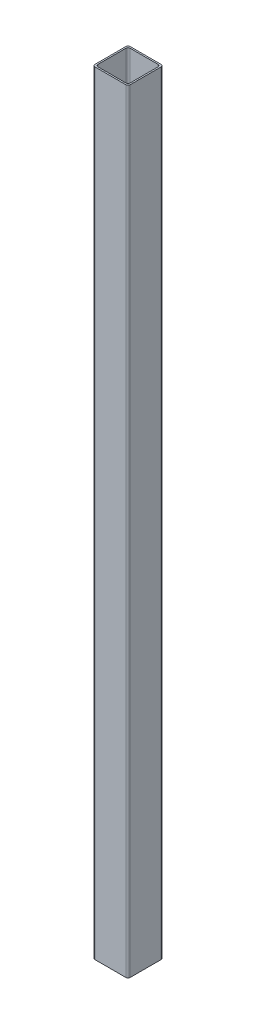
ISO-10303-21;
HEADER;
FILE_DESCRIPTION(('STEP AP214'),'2;1');
FILE_NAME('part.step','',(''),(''),'','','');
FILE_SCHEMA(('AUTOMOTIVE_DESIGN { 1 0 10303 214 1 1 1 1 }'));
ENDSEC;
DATA;
#1=APPLICATION_CONTEXT('core data for automotive mechanical design processes');
#2=APPLICATION_PROTOCOL_DEFINITION('international standard','automotive_design',2000,#1);
#3=PRODUCT_CONTEXT('',#1,'mechanical');
#4=PRODUCT('Part','Part','',(#3));
#5=PRODUCT_RELATED_PRODUCT_CATEGORY('part','',(#4));
#6=PRODUCT_DEFINITION_FORMATION('','',#4);
#7=PRODUCT_DEFINITION_CONTEXT('part definition',#1,'design');
#8=PRODUCT_DEFINITION('design','',#6,#7);
#9=PRODUCT_DEFINITION_SHAPE('','',#8);
#10=(LENGTH_UNIT() NAMED_UNIT(*) SI_UNIT(.MILLI.,.METRE.));
#11=(NAMED_UNIT(*) PLANE_ANGLE_UNIT() SI_UNIT($,.RADIAN.));
#12=(NAMED_UNIT(*) SI_UNIT($,.STERADIAN.) SOLID_ANGLE_UNIT());
#13=UNCERTAINTY_MEASURE_WITH_UNIT(LENGTH_MEASURE(1.E-05),#10,'distance_accuracy_value','');
#14=(GEOMETRIC_REPRESENTATION_CONTEXT(3) GLOBAL_UNCERTAINTY_ASSIGNED_CONTEXT((#13)) GLOBAL_UNIT_ASSIGNED_CONTEXT((#10,
#11,#12)) REPRESENTATION_CONTEXT('',''));
#15=CARTESIAN_POINT('',(0.,0.,0.));
#16=DIRECTION('',(0.,0.,1.));
#17=DIRECTION('',(1.,0.,0.));
#18=AXIS2_PLACEMENT_3D('',#15,#16,#17);
#19=CARTESIAN_POINT('',(-1.8,90.,1.8));
#20=DIRECTION('',(0.,-1.,0.));
#21=DIRECTION('',(0.,0.,-1.));
#22=AXIS2_PLACEMENT_3D('',#19,#20,#21);
#23=PLANE('',#22);
#24=CARTESIAN_POINT('',(-1.8,90.,1.8));
#25=DIRECTION('',(0.,1.,0.));
#26=DIRECTION('',(0.,0.,-1.));
#27=AXIS2_PLACEMENT_3D('',#24,#25,#26);
#28=CIRCLE('',#27,0.25);
#29=CARTESIAN_POINT('',(-2.05,90.,1.8));
#30=VERTEX_POINT('',#29);
#31=CARTESIAN_POINT('',(-1.8,90.,2.05));
#32=VERTEX_POINT('',#31);
#33=EDGE_CURVE('E217',#30,#32,#28,.T.);
#34=ORIENTED_EDGE('',*,*,#33,.T.);
#35=DIRECTION('',(1.,0.,0.));
#36=VECTOR('',#35,1.);
#37=CARTESIAN_POINT('',(-1.8,90.,2.05));
#38=LINE('',#37,#36);
#39=CARTESIAN_POINT('',(1.8,90.,2.05));
#40=VERTEX_POINT('',#39);
#41=EDGE_CURVE('E220',#32,#40,#38,.T.);
#42=ORIENTED_EDGE('',*,*,#41,.T.);
#43=CARTESIAN_POINT('',(1.8,90.,1.8));
#44=DIRECTION('',(0.,1.,0.));
#45=DIRECTION('',(0.,0.,1.));
#46=AXIS2_PLACEMENT_3D('',#43,#44,#45);
#47=CIRCLE('',#46,0.25);
#48=CARTESIAN_POINT('',(2.05,90.,1.8));
#49=VERTEX_POINT('',#48);
#50=EDGE_CURVE('E223',#40,#49,#47,.T.);
#51=ORIENTED_EDGE('',*,*,#50,.T.);
#52=DIRECTION('',(0.,0.,-1.));
#53=VECTOR('',#52,1.);
#54=CARTESIAN_POINT('',(2.05,90.,1.8));
#55=LINE('',#54,#53);
#56=CARTESIAN_POINT('',(2.05,90.,-1.8));
#57=VERTEX_POINT('',#56);
#58=EDGE_CURVE('E225',#49,#57,#55,.T.);
#59=ORIENTED_EDGE('',*,*,#58,.T.);
#60=CARTESIAN_POINT('',(1.8,90.,-1.8));
#61=DIRECTION('',(0.,1.,0.));
#62=DIRECTION('',(0.,0.,-1.));
#63=AXIS2_PLACEMENT_3D('',#60,#61,#62);
#64=CIRCLE('',#63,0.25);
#65=CARTESIAN_POINT('',(1.8,90.,-2.05));
#66=VERTEX_POINT('',#65);
#67=EDGE_CURVE('E227',#57,#66,#64,.T.);
#68=ORIENTED_EDGE('',*,*,#67,.T.);
#69=DIRECTION('',(-1.,0.,0.));
#70=VECTOR('',#69,1.);
#71=CARTESIAN_POINT('',(-1.8,90.,-2.05));
#72=LINE('',#71,#70);
#73=CARTESIAN_POINT('',(-1.8,90.,-2.05));
#74=VERTEX_POINT('',#73);
#75=EDGE_CURVE('E229',#66,#74,#72,.T.);
#76=ORIENTED_EDGE('',*,*,#75,.T.);
#77=CARTESIAN_POINT('',(-1.8,90.,-1.8));
#78=DIRECTION('',(0.,1.,0.));
#79=DIRECTION('',(0.,0.,-1.));
#80=AXIS2_PLACEMENT_3D('',#77,#78,#79);
#81=CIRCLE('',#80,0.25);
#82=CARTESIAN_POINT('',(-2.05,90.,-1.8));
#83=VERTEX_POINT('',#82);
#84=EDGE_CURVE('E231',#74,#83,#81,.T.);
#85=ORIENTED_EDGE('',*,*,#84,.T.);
#86=DIRECTION('',(0.,0.,1.));
#87=VECTOR('',#86,1.);
#88=CARTESIAN_POINT('',(-2.05,90.,1.8));
#89=LINE('',#88,#87);
#90=EDGE_CURVE('E233',#83,#30,#89,.T.);
#91=ORIENTED_EDGE('',*,*,#90,.T.);
#92=EDGE_LOOP('',(#34,#42,#51,#59,#68,#76,#85,#91));
#93=FACE_BOUND('',#92,.T.);
#94=CARTESIAN_POINT('',(1.625,90.,1.625));
#95=DIRECTION('',(0.,1.,0.));
#96=DIRECTION('',(0.,0.,1.));
#97=AXIS2_PLACEMENT_3D('',#94,#95,#96);
#98=CIRCLE('',#97,0.25);
#99=CARTESIAN_POINT('',(1.625,90.,1.875));
#100=VERTEX_POINT('',#99);
#101=CARTESIAN_POINT('',(1.875,90.,1.625));
#102=VERTEX_POINT('',#101);
#103=EDGE_CURVE('E152',#100,#102,#98,.T.);
#104=ORIENTED_EDGE('',*,*,#103,.F.);
#105=DIRECTION('',(1.,0.,0.));
#106=VECTOR('',#105,1.);
#107=CARTESIAN_POINT('',(-1.625,90.,1.875));
#108=LINE('',#107,#106);
#109=CARTESIAN_POINT('',(-1.625,90.,1.875));
#110=VERTEX_POINT('',#109);
#111=EDGE_CURVE('E185',#110,#100,#108,.T.);
#112=ORIENTED_EDGE('',*,*,#111,.F.);
#113=CARTESIAN_POINT('',(-1.625,90.,1.625));
#114=DIRECTION('',(0.,1.,0.));
#115=DIRECTION('',(0.,0.,-1.));
#116=AXIS2_PLACEMENT_3D('',#113,#114,#115);
#117=CIRCLE('',#116,0.25);
#118=CARTESIAN_POINT('',(-1.875,90.,1.625));
#119=VERTEX_POINT('',#118);
#120=EDGE_CURVE('E183',#119,#110,#117,.T.);
#121=ORIENTED_EDGE('',*,*,#120,.F.);
#122=DIRECTION('',(0.,0.,1.));
#123=VECTOR('',#122,1.);
#124=CARTESIAN_POINT('',(-1.875,90.,1.625));
#125=LINE('',#124,#123);
#126=CARTESIAN_POINT('',(-1.875,90.,-1.625));
#127=VERTEX_POINT('',#126);
#128=EDGE_CURVE('E181',#127,#119,#125,.T.);
#129=ORIENTED_EDGE('',*,*,#128,.F.);
#130=CARTESIAN_POINT('',(-1.625,90.,-1.625));
#131=DIRECTION('',(0.,1.,0.));
#132=DIRECTION('',(0.,0.,-1.));
#133=AXIS2_PLACEMENT_3D('',#130,#131,#132);
#134=CIRCLE('',#133,0.25);
#135=CARTESIAN_POINT('',(-1.625,90.,-1.875));
#136=VERTEX_POINT('',#135);
#137=EDGE_CURVE('E179',#136,#127,#134,.T.);
#138=ORIENTED_EDGE('',*,*,#137,.F.);
#139=DIRECTION('',(-1.,0.,0.));
#140=VECTOR('',#139,1.);
#141=CARTESIAN_POINT('',(-1.625,90.,-1.875));
#142=LINE('',#141,#140);
#143=CARTESIAN_POINT('',(1.625,90.,-1.875));
#144=VERTEX_POINT('',#143);
#145=EDGE_CURVE('E175',#144,#136,#142,.T.);
#146=ORIENTED_EDGE('',*,*,#145,.F.);
#147=CARTESIAN_POINT('',(1.625,90.,-1.625));
#148=DIRECTION('',(0.,1.,0.));
#149=DIRECTION('',(0.,0.,-1.));
#150=AXIS2_PLACEMENT_3D('',#147,#148,#149);
#151=CIRCLE('',#150,0.25);
#152=CARTESIAN_POINT('',(1.875,90.,-1.625));
#153=VERTEX_POINT('',#152);
#154=EDGE_CURVE('E173',#153,#144,#151,.T.);
#155=ORIENTED_EDGE('',*,*,#154,.F.);
#156=DIRECTION('',(0.,0.,-1.));
#157=VECTOR('',#156,1.);
#158=CARTESIAN_POINT('',(1.875,90.,1.625));
#159=LINE('',#158,#157);
#160=EDGE_CURVE('E160',#102,#153,#159,.T.);
#161=ORIENTED_EDGE('',*,*,#160,.F.);
#162=EDGE_LOOP('',(#104,#112,#121,#129,#138,#146,#155,#161));
#163=FACE_BOUND('',#162,.T.);
#164=ADVANCED_FACE('F39',(#93,#163),#23,.F.);
#165=CARTESIAN_POINT('',(-1.8,0.,1.8));
#166=DIRECTION('',(0.,-1.,0.));
#167=DIRECTION('',(0.,0.,-1.));
#168=AXIS2_PLACEMENT_3D('',#165,#166,#167);
#169=PLANE('',#168);
#170=CARTESIAN_POINT('',(-1.8,0.,1.8));
#171=DIRECTION('',(0.,1.,0.));
#172=DIRECTION('',(0.,0.,-1.));
#173=AXIS2_PLACEMENT_3D('',#170,#171,#172);
#174=CIRCLE('',#173,0.25);
#175=CARTESIAN_POINT('',(-2.05,0.,1.8));
#176=VERTEX_POINT('',#175);
#177=CARTESIAN_POINT('',(-1.8,0.,2.05));
#178=VERTEX_POINT('',#177);
#179=EDGE_CURVE('E168',#176,#178,#174,.T.);
#180=ORIENTED_EDGE('',*,*,#179,.F.);
#181=DIRECTION('',(0.,0.,1.));
#182=VECTOR('',#181,1.);
#183=CARTESIAN_POINT('',(-2.05,0.,1.8));
#184=LINE('',#183,#182);
#185=CARTESIAN_POINT('',(-2.05,0.,-1.8));
#186=VERTEX_POINT('',#185);
#187=EDGE_CURVE('E221',#186,#176,#184,.T.);
#188=ORIENTED_EDGE('',*,*,#187,.F.);
#189=CARTESIAN_POINT('',(-1.8,0.,-1.8));
#190=DIRECTION('',(0.,1.,0.));
#191=DIRECTION('',(0.,0.,-1.));
#192=AXIS2_PLACEMENT_3D('',#189,#190,#191);
#193=CIRCLE('',#192,0.25);
#194=CARTESIAN_POINT('',(-1.8,0.,-2.05));
#195=VERTEX_POINT('',#194);
#196=EDGE_CURVE('E248',#195,#186,#193,.T.);
#197=ORIENTED_EDGE('',*,*,#196,.F.);
#198=DIRECTION('',(-1.,0.,0.));
#199=VECTOR('',#198,1.);
#200=CARTESIAN_POINT('',(-1.8,0.,-2.05));
#201=LINE('',#200,#199);
#202=CARTESIAN_POINT('',(1.8,0.,-2.05));
#203=VERTEX_POINT('',#202);
#204=EDGE_CURVE('E246',#203,#195,#201,.T.);
#205=ORIENTED_EDGE('',*,*,#204,.F.);
#206=CARTESIAN_POINT('',(1.8,0.,-1.8));
#207=DIRECTION('',(0.,1.,0.));
#208=DIRECTION('',(0.,0.,-1.));
#209=AXIS2_PLACEMENT_3D('',#206,#207,#208);
#210=CIRCLE('',#209,0.25);
#211=CARTESIAN_POINT('',(2.05,0.,-1.8));
#212=VERTEX_POINT('',#211);
#213=EDGE_CURVE('E244',#212,#203,#210,.T.);
#214=ORIENTED_EDGE('',*,*,#213,.F.);
#215=DIRECTION('',(0.,0.,-1.));
#216=VECTOR('',#215,1.);
#217=CARTESIAN_POINT('',(2.05,0.,1.8));
#218=LINE('',#217,#216);
#219=CARTESIAN_POINT('',(2.05,0.,1.8));
#220=VERTEX_POINT('',#219);
#221=EDGE_CURVE('E242',#220,#212,#218,.T.);
#222=ORIENTED_EDGE('',*,*,#221,.F.);
#223=CARTESIAN_POINT('',(1.8,0.,1.8));
#224=DIRECTION('',(0.,1.,0.));
#225=DIRECTION('',(0.,0.,1.));
#226=AXIS2_PLACEMENT_3D('',#223,#224,#225);
#227=CIRCLE('',#226,0.25);
#228=CARTESIAN_POINT('',(1.8,0.,2.05));
#229=VERTEX_POINT('',#228);
#230=EDGE_CURVE('E240',#229,#220,#227,.T.);
#231=ORIENTED_EDGE('',*,*,#230,.F.);
#232=DIRECTION('',(1.,0.,0.));
#233=VECTOR('',#232,1.);
#234=CARTESIAN_POINT('',(-1.8,0.,2.05));
#235=LINE('',#234,#233);
#236=EDGE_CURVE('E238',#178,#229,#235,.T.);
#237=ORIENTED_EDGE('',*,*,#236,.F.);
#238=EDGE_LOOP('',(#180,#188,#197,#205,#214,#222,#231,#237));
#239=FACE_BOUND('',#238,.T.);
#240=DIRECTION('',(1.,0.,0.));
#241=VECTOR('',#240,1.);
#242=CARTESIAN_POINT('',(-1.625,0.,1.875));
#243=LINE('',#242,#241);
#244=CARTESIAN_POINT('',(-1.625,0.,1.875));
#245=VERTEX_POINT('',#244);
#246=CARTESIAN_POINT('',(1.625,0.,1.875));
#247=VERTEX_POINT('',#246);
#248=EDGE_CURVE('E161',#245,#247,#243,.T.);
#249=ORIENTED_EDGE('',*,*,#248,.T.);
#250=CARTESIAN_POINT('',(1.625,0.,1.625));
#251=DIRECTION('',(0.,1.,0.));
#252=DIRECTION('',(0.,0.,1.));
#253=AXIS2_PLACEMENT_3D('',#250,#251,#252);
#254=CIRCLE('',#253,0.25);
#255=CARTESIAN_POINT('',(1.875,0.,1.625));
#256=VERTEX_POINT('',#255);
#257=EDGE_CURVE('E62',#247,#256,#254,.T.);
#258=ORIENTED_EDGE('',*,*,#257,.T.);
#259=DIRECTION('',(0.,0.,-1.));
#260=VECTOR('',#259,1.);
#261=CARTESIAN_POINT('',(1.875,0.,1.625));
#262=LINE('',#261,#260);
#263=CARTESIAN_POINT('',(1.875,0.,-1.625));
#264=VERTEX_POINT('',#263);
#265=EDGE_CURVE('E167',#256,#264,#262,.T.);
#266=ORIENTED_EDGE('',*,*,#265,.T.);
#267=CARTESIAN_POINT('',(1.625,0.,-1.625));
#268=DIRECTION('',(0.,1.,0.));
#269=DIRECTION('',(0.,0.,-1.));
#270=AXIS2_PLACEMENT_3D('',#267,#268,#269);
#271=CIRCLE('',#270,0.25);
#272=CARTESIAN_POINT('',(1.625,0.,-1.875));
#273=VERTEX_POINT('',#272);
#274=EDGE_CURVE('E189',#264,#273,#271,.T.);
#275=ORIENTED_EDGE('',*,*,#274,.T.);
#276=DIRECTION('',(-1.,0.,0.));
#277=VECTOR('',#276,1.);
#278=CARTESIAN_POINT('',(-1.625,0.,-1.875));
#279=LINE('',#278,#277);
#280=CARTESIAN_POINT('',(-1.625,0.,-1.875));
#281=VERTEX_POINT('',#280);
#282=EDGE_CURVE('E192',#273,#281,#279,.T.);
#283=ORIENTED_EDGE('',*,*,#282,.T.);
#284=CARTESIAN_POINT('',(-1.625,0.,-1.625));
#285=DIRECTION('',(0.,1.,0.));
#286=DIRECTION('',(0.,0.,-1.));
#287=AXIS2_PLACEMENT_3D('',#284,#285,#286);
#288=CIRCLE('',#287,0.25);
#289=CARTESIAN_POINT('',(-1.875,0.,-1.625));
#290=VERTEX_POINT('',#289);
#291=EDGE_CURVE('E195',#281,#290,#288,.T.);
#292=ORIENTED_EDGE('',*,*,#291,.T.);
#293=DIRECTION('',(0.,0.,1.));
#294=VECTOR('',#293,1.);
#295=CARTESIAN_POINT('',(-1.875,0.,1.625));
#296=LINE('',#295,#294);
#297=CARTESIAN_POINT('',(-1.875,0.,1.625));
#298=VERTEX_POINT('',#297);
#299=EDGE_CURVE('E198',#290,#298,#296,.T.);
#300=ORIENTED_EDGE('',*,*,#299,.T.);
#301=CARTESIAN_POINT('',(-1.625,0.,1.625));
#302=DIRECTION('',(0.,1.,0.));
#303=DIRECTION('',(0.,0.,-1.));
#304=AXIS2_PLACEMENT_3D('',#301,#302,#303);
#305=CIRCLE('',#304,0.25);
#306=EDGE_CURVE('E201',#298,#245,#305,.T.);
#307=ORIENTED_EDGE('',*,*,#306,.T.);
#308=EDGE_LOOP('',(#249,#258,#266,#275,#283,#292,#300,#307));
#309=FACE_BOUND('',#308,.T.);
#310=ADVANCED_FACE('F278',(#239,#309),#169,.T.);
#311=CARTESIAN_POINT('',(-1.8,90.,1.8));
#312=DIRECTION('',(0.,-1.,0.));
#313=DIRECTION('',(0.,0.,-1.));
#314=AXIS2_PLACEMENT_3D('',#311,#312,#313);
#315=CYLINDRICAL_SURFACE('',#314,0.25);
#316=ORIENTED_EDGE('',*,*,#179,.T.);
#317=DIRECTION('',(0.,-1.,0.));
#318=VECTOR('',#317,1.);
#319=CARTESIAN_POINT('',(-1.8,90.,2.05));
#320=LINE('',#319,#318);
#321=EDGE_CURVE('E11',#32,#178,#320,.T.);
#322=ORIENTED_EDGE('',*,*,#321,.F.);
#323=ORIENTED_EDGE('',*,*,#33,.F.);
#324=DIRECTION('',(0.,-1.,0.));
#325=VECTOR('',#324,1.);
#326=CARTESIAN_POINT('',(-2.05,90.,1.8));
#327=LINE('',#326,#325);
#328=EDGE_CURVE('E235',#30,#176,#327,.T.);
#329=ORIENTED_EDGE('',*,*,#328,.T.);
#330=EDGE_LOOP('',(#316,#322,#323,#329));
#331=FACE_BOUND('',#330,.T.);
#332=ADVANCED_FACE('F41',(#331),#315,.T.);
#333=CARTESIAN_POINT('',(-1.8,90.,2.05));
#334=DIRECTION('',(0.,0.,-1.));
#335=DIRECTION('',(-1.,0.,0.));
#336=AXIS2_PLACEMENT_3D('',#333,#334,#335);
#337=PLANE('',#336);
#338=ORIENTED_EDGE('',*,*,#236,.T.);
#339=DIRECTION('',(0.,-1.,0.));
#340=VECTOR('',#339,1.);
#341=CARTESIAN_POINT('',(1.8,90.,2.05));
#342=LINE('',#341,#340);
#343=EDGE_CURVE('E47',#40,#229,#342,.T.);
#344=ORIENTED_EDGE('',*,*,#343,.F.);
#345=ORIENTED_EDGE('',*,*,#41,.F.);
#346=ORIENTED_EDGE('',*,*,#321,.T.);
#347=EDGE_LOOP('',(#338,#344,#345,#346));
#348=FACE_BOUND('',#347,.T.);
#349=ADVANCED_FACE('F295',(#348),#337,.F.);
#350=CARTESIAN_POINT('',(1.8,90.,1.8));
#351=DIRECTION('',(0.,-1.,0.));
#352=DIRECTION('',(0.,0.,-1.));
#353=AXIS2_PLACEMENT_3D('',#350,#351,#352);
#354=CYLINDRICAL_SURFACE('',#353,0.25);
#355=ORIENTED_EDGE('',*,*,#230,.T.);
#356=DIRECTION('',(0.,-1.,0.));
#357=VECTOR('',#356,1.);
#358=CARTESIAN_POINT('',(2.05,90.,1.8));
#359=LINE('',#358,#357);
#360=EDGE_CURVE('E265',#49,#220,#359,.T.);
#361=ORIENTED_EDGE('',*,*,#360,.F.);
#362=ORIENTED_EDGE('',*,*,#50,.F.);
#363=ORIENTED_EDGE('',*,*,#343,.T.);
#364=EDGE_LOOP('',(#355,#361,#362,#363));
#365=FACE_BOUND('',#364,.T.);
#366=ADVANCED_FACE('F272',(#365),#354,.T.);
#367=CARTESIAN_POINT('',(2.05,90.,1.8));
#368=DIRECTION('',(-1.,0.,0.));
#369=DIRECTION('',(0.,0.,1.));
#370=AXIS2_PLACEMENT_3D('',#367,#368,#369);
#371=PLANE('',#370);
#372=ORIENTED_EDGE('',*,*,#221,.T.);
#373=DIRECTION('',(0.,-1.,0.));
#374=VECTOR('',#373,1.);
#375=CARTESIAN_POINT('',(2.05,90.,-1.8));
#376=LINE('',#375,#374);
#377=EDGE_CURVE('E262',#57,#212,#376,.T.);
#378=ORIENTED_EDGE('',*,*,#377,.F.);
#379=ORIENTED_EDGE('',*,*,#58,.F.);
#380=ORIENTED_EDGE('',*,*,#360,.T.);
#381=EDGE_LOOP('',(#372,#378,#379,#380));
#382=FACE_BOUND('',#381,.T.);
#383=ADVANCED_FACE('F284',(#382),#371,.F.);
#384=CARTESIAN_POINT('',(1.8,90.,-1.8));
#385=DIRECTION('',(0.,-1.,0.));
#386=DIRECTION('',(0.,0.,-1.));
#387=AXIS2_PLACEMENT_3D('',#384,#385,#386);
#388=CYLINDRICAL_SURFACE('',#387,0.25);
#389=ORIENTED_EDGE('',*,*,#213,.T.);
#390=DIRECTION('',(0.,-1.,0.));
#391=VECTOR('',#390,1.);
#392=CARTESIAN_POINT('',(1.8,90.,-2.05));
#393=LINE('',#392,#391);
#394=EDGE_CURVE('E259',#66,#203,#393,.T.);
#395=ORIENTED_EDGE('',*,*,#394,.F.);
#396=ORIENTED_EDGE('',*,*,#67,.F.);
#397=ORIENTED_EDGE('',*,*,#377,.T.);
#398=EDGE_LOOP('',(#389,#395,#396,#397));
#399=FACE_BOUND('',#398,.T.);
#400=ADVANCED_FACE('F288',(#399),#388,.T.);
#401=CARTESIAN_POINT('',(-1.8,90.,-2.05));
#402=DIRECTION('',(0.,0.,1.));
#403=DIRECTION('',(1.,0.,0.));
#404=AXIS2_PLACEMENT_3D('',#401,#402,#403);
#405=PLANE('',#404);
#406=ORIENTED_EDGE('',*,*,#204,.T.);
#407=DIRECTION('',(0.,-1.,0.));
#408=VECTOR('',#407,1.);
#409=CARTESIAN_POINT('',(-1.8,90.,-2.05));
#410=LINE('',#409,#408);
#411=EDGE_CURVE('E256',#74,#195,#410,.T.);
#412=ORIENTED_EDGE('',*,*,#411,.F.);
#413=ORIENTED_EDGE('',*,*,#75,.F.);
#414=ORIENTED_EDGE('',*,*,#394,.T.);
#415=EDGE_LOOP('',(#406,#412,#413,#414));
#416=FACE_BOUND('',#415,.T.);
#417=ADVANCED_FACE('F308',(#416),#405,.F.);
#418=CARTESIAN_POINT('',(-1.8,90.,-1.8));
#419=DIRECTION('',(0.,-1.,0.));
#420=DIRECTION('',(0.,0.,-1.));
#421=AXIS2_PLACEMENT_3D('',#418,#419,#420);
#422=CYLINDRICAL_SURFACE('',#421,0.25);
#423=ORIENTED_EDGE('',*,*,#196,.T.);
#424=DIRECTION('',(0.,-1.,0.));
#425=VECTOR('',#424,1.);
#426=CARTESIAN_POINT('',(-2.05,90.,-1.8));
#427=LINE('',#426,#425);
#428=EDGE_CURVE('E253',#83,#186,#427,.T.);
#429=ORIENTED_EDGE('',*,*,#428,.F.);
#430=ORIENTED_EDGE('',*,*,#84,.F.);
#431=ORIENTED_EDGE('',*,*,#411,.T.);
#432=EDGE_LOOP('',(#423,#429,#430,#431));
#433=FACE_BOUND('',#432,.T.);
#434=ADVANCED_FACE('F306',(#433),#422,.T.);
#435=CARTESIAN_POINT('',(-2.05,90.,1.8));
#436=DIRECTION('',(1.,0.,0.));
#437=DIRECTION('',(0.,0.,-1.));
#438=AXIS2_PLACEMENT_3D('',#435,#436,#437);
#439=PLANE('',#438);
#440=ORIENTED_EDGE('',*,*,#187,.T.);
#441=ORIENTED_EDGE('',*,*,#328,.F.);
#442=ORIENTED_EDGE('',*,*,#90,.F.);
#443=ORIENTED_EDGE('',*,*,#428,.T.);
#444=EDGE_LOOP('',(#440,#441,#442,#443));
#445=FACE_BOUND('',#444,.T.);
#446=ADVANCED_FACE('F301',(#445),#439,.F.);
#447=CARTESIAN_POINT('',(1.625,90.,1.625));
#448=DIRECTION('',(0.,-1.,0.));
#449=DIRECTION('',(0.,0.,-1.));
#450=AXIS2_PLACEMENT_3D('',#447,#448,#449);
#451=CYLINDRICAL_SURFACE('',#450,0.25);
#452=ORIENTED_EDGE('',*,*,#257,.F.);
#453=DIRECTION('',(0.,-1.,0.));
#454=VECTOR('',#453,1.);
#455=CARTESIAN_POINT('',(1.625,90.,1.875));
#456=LINE('',#455,#454);
#457=EDGE_CURVE('E156',#100,#247,#456,.T.);
#458=ORIENTED_EDGE('',*,*,#457,.F.);
#459=ORIENTED_EDGE('',*,*,#103,.T.);
#460=DIRECTION('',(0.,-1.,0.));
#461=VECTOR('',#460,1.);
#462=CARTESIAN_POINT('',(1.875,90.,1.625));
#463=LINE('',#462,#461);
#464=EDGE_CURVE('E155',#102,#256,#463,.T.);
#465=ORIENTED_EDGE('',*,*,#464,.T.);
#466=EDGE_LOOP('',(#452,#458,#459,#465));
#467=FACE_BOUND('',#466,.T.);
#468=ADVANCED_FACE('F154',(#467),#451,.F.);
#469=CARTESIAN_POINT('',(1.875,90.,1.625));
#470=DIRECTION('',(-1.,0.,0.));
#471=DIRECTION('',(0.,0.,1.));
#472=AXIS2_PLACEMENT_3D('',#469,#470,#471);
#473=PLANE('',#472);
#474=ORIENTED_EDGE('',*,*,#265,.F.);
#475=ORIENTED_EDGE('',*,*,#464,.F.);
#476=ORIENTED_EDGE('',*,*,#160,.T.);
#477=DIRECTION('',(0.,-1.,0.));
#478=VECTOR('',#477,1.);
#479=CARTESIAN_POINT('',(1.875,90.,-1.625));
#480=LINE('',#479,#478);
#481=EDGE_CURVE('E169',#153,#264,#480,.T.);
#482=ORIENTED_EDGE('',*,*,#481,.T.);
#483=EDGE_LOOP('',(#474,#475,#476,#482));
#484=FACE_BOUND('',#483,.T.);
#485=ADVANCED_FACE('F164',(#484),#473,.T.);
#486=CARTESIAN_POINT('',(1.625,90.,-1.625));
#487=DIRECTION('',(0.,-1.,0.));
#488=DIRECTION('',(0.,0.,-1.));
#489=AXIS2_PLACEMENT_3D('',#486,#487,#488);
#490=CYLINDRICAL_SURFACE('',#489,0.25);
#491=ORIENTED_EDGE('',*,*,#274,.F.);
#492=ORIENTED_EDGE('',*,*,#481,.F.);
#493=ORIENTED_EDGE('',*,*,#154,.T.);
#494=DIRECTION('',(0.,-1.,0.));
#495=VECTOR('',#494,1.);
#496=CARTESIAN_POINT('',(1.625,90.,-1.875));
#497=LINE('',#496,#495);
#498=EDGE_CURVE('E214',#144,#273,#497,.T.);
#499=ORIENTED_EDGE('',*,*,#498,.T.);
#500=EDGE_LOOP('',(#491,#492,#493,#499));
#501=FACE_BOUND('',#500,.T.);
#502=ADVANCED_FACE('F333',(#501),#490,.F.);
#503=CARTESIAN_POINT('',(-1.625,90.,-1.875));
#504=DIRECTION('',(0.,0.,1.));
#505=DIRECTION('',(1.,0.,0.));
#506=AXIS2_PLACEMENT_3D('',#503,#504,#505);
#507=PLANE('',#506);
#508=ORIENTED_EDGE('',*,*,#282,.F.);
#509=ORIENTED_EDGE('',*,*,#498,.F.);
#510=ORIENTED_EDGE('',*,*,#145,.T.);
#511=DIRECTION('',(0.,-1.,0.));
#512=VECTOR('',#511,1.);
#513=CARTESIAN_POINT('',(-1.625,90.,-1.875));
#514=LINE('',#513,#512);
#515=EDGE_CURVE('E212',#136,#281,#514,.T.);
#516=ORIENTED_EDGE('',*,*,#515,.T.);
#517=EDGE_LOOP('',(#508,#509,#510,#516));
#518=FACE_BOUND('',#517,.T.);
#519=ADVANCED_FACE('F337',(#518),#507,.T.);
#520=CARTESIAN_POINT('',(-1.625,90.,-1.625));
#521=DIRECTION('',(0.,-1.,0.));
#522=DIRECTION('',(0.,0.,-1.));
#523=AXIS2_PLACEMENT_3D('',#520,#521,#522);
#524=CYLINDRICAL_SURFACE('',#523,0.25);
#525=ORIENTED_EDGE('',*,*,#291,.F.);
#526=ORIENTED_EDGE('',*,*,#515,.F.);
#527=ORIENTED_EDGE('',*,*,#137,.T.);
#528=DIRECTION('',(0.,-1.,0.));
#529=VECTOR('',#528,1.);
#530=CARTESIAN_POINT('',(-1.875,90.,-1.625));
#531=LINE('',#530,#529);
#532=EDGE_CURVE('E210',#127,#290,#531,.T.);
#533=ORIENTED_EDGE('',*,*,#532,.T.);
#534=EDGE_LOOP('',(#525,#526,#527,#533));
#535=FACE_BOUND('',#534,.T.);
#536=ADVANCED_FACE('F343',(#535),#524,.F.);
#537=CARTESIAN_POINT('',(-1.875,90.,1.625));
#538=DIRECTION('',(1.,0.,0.));
#539=DIRECTION('',(0.,0.,-1.));
#540=AXIS2_PLACEMENT_3D('',#537,#538,#539);
#541=PLANE('',#540);
#542=ORIENTED_EDGE('',*,*,#299,.F.);
#543=ORIENTED_EDGE('',*,*,#532,.F.);
#544=ORIENTED_EDGE('',*,*,#128,.T.);
#545=DIRECTION('',(0.,-1.,0.));
#546=VECTOR('',#545,1.);
#547=CARTESIAN_POINT('',(-1.875,90.,1.625));
#548=LINE('',#547,#546);
#549=EDGE_CURVE('E208',#119,#298,#548,.T.);
#550=ORIENTED_EDGE('',*,*,#549,.T.);
#551=EDGE_LOOP('',(#542,#543,#544,#550));
#552=FACE_BOUND('',#551,.T.);
#553=ADVANCED_FACE('F347',(#552),#541,.T.);
#554=CARTESIAN_POINT('',(-1.625,90.,1.625));
#555=DIRECTION('',(0.,-1.,0.));
#556=DIRECTION('',(0.,0.,-1.));
#557=AXIS2_PLACEMENT_3D('',#554,#555,#556);
#558=CYLINDRICAL_SURFACE('',#557,0.25);
#559=ORIENTED_EDGE('',*,*,#306,.F.);
#560=ORIENTED_EDGE('',*,*,#549,.F.);
#561=ORIENTED_EDGE('',*,*,#120,.T.);
#562=DIRECTION('',(0.,-1.,0.));
#563=VECTOR('',#562,1.);
#564=CARTESIAN_POINT('',(-1.625,90.,1.875));
#565=LINE('',#564,#563);
#566=EDGE_CURVE('E54',#110,#245,#565,.T.);
#567=ORIENTED_EDGE('',*,*,#566,.T.);
#568=EDGE_LOOP('',(#559,#560,#561,#567));
#569=FACE_BOUND('',#568,.T.);
#570=ADVANCED_FACE('F351',(#569),#558,.F.);
#571=CARTESIAN_POINT('',(-1.625,90.,1.875));
#572=DIRECTION('',(0.,0.,-1.));
#573=DIRECTION('',(-1.,0.,0.));
#574=AXIS2_PLACEMENT_3D('',#571,#572,#573);
#575=PLANE('',#574);
#576=ORIENTED_EDGE('',*,*,#248,.F.);
#577=ORIENTED_EDGE('',*,*,#566,.F.);
#578=ORIENTED_EDGE('',*,*,#111,.T.);
#579=ORIENTED_EDGE('',*,*,#457,.T.);
#580=EDGE_LOOP('',(#576,#577,#578,#579));
#581=FACE_BOUND('',#580,.T.);
#582=ADVANCED_FACE('F355',(#581),#575,.T.);
#583=CLOSED_SHELL('',(#164,#310,#332,#349,#366,#383,#400,#417,#434,#446,#468,#485,#502,#519,
#536,#553,#570,#582));
#584=MANIFOLD_SOLID_BREP('B2',#583);
#585=ADVANCED_BREP_SHAPE_REPRESENTATION('',(#18,#584),#14);
#586=SHAPE_DEFINITION_REPRESENTATION(#9,#585);
ENDSEC;
END-ISO-10303-21;
